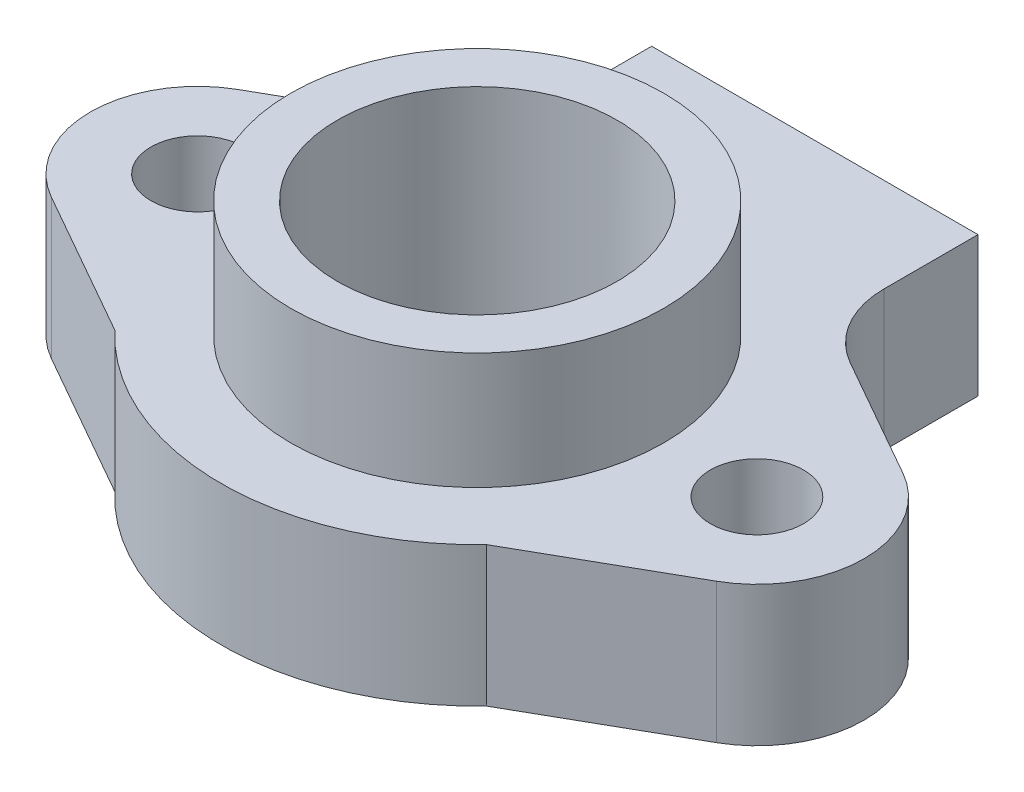
ISO-10303-21;
HEADER;
FILE_DESCRIPTION(('STEP AP214'),'2;1');
FILE_NAME('part.step','',(''),(''),'','','');
FILE_SCHEMA(('AUTOMOTIVE_DESIGN { 1 0 10303 214 1 1 1 1 }'));
ENDSEC;
DATA;
#1=APPLICATION_CONTEXT('core data for automotive mechanical design processes');
#2=APPLICATION_PROTOCOL_DEFINITION('international standard','automotive_design',2000,#1);
#3=PRODUCT_CONTEXT('',#1,'mechanical');
#4=PRODUCT('Part','Part','',(#3));
#5=PRODUCT_RELATED_PRODUCT_CATEGORY('part','',(#4));
#6=PRODUCT_DEFINITION_FORMATION('','',#4);
#7=PRODUCT_DEFINITION_CONTEXT('part definition',#1,'design');
#8=PRODUCT_DEFINITION('design','',#6,#7);
#9=PRODUCT_DEFINITION_SHAPE('','',#8);
#10=(LENGTH_UNIT() NAMED_UNIT(*) SI_UNIT(.MILLI.,.METRE.));
#11=(NAMED_UNIT(*) PLANE_ANGLE_UNIT() SI_UNIT($,.RADIAN.));
#12=(NAMED_UNIT(*) SI_UNIT($,.STERADIAN.) SOLID_ANGLE_UNIT());
#13=UNCERTAINTY_MEASURE_WITH_UNIT(LENGTH_MEASURE(1.E-05),#10,'distance_accuracy_value','');
#14=(GEOMETRIC_REPRESENTATION_CONTEXT(3) GLOBAL_UNCERTAINTY_ASSIGNED_CONTEXT((#13)) GLOBAL_UNIT_ASSIGNED_CONTEXT((#10,
#11,#12)) REPRESENTATION_CONTEXT('',''));
#15=CARTESIAN_POINT('',(0.,0.,0.));
#16=DIRECTION('',(0.,0.,1.));
#17=DIRECTION('',(1.,0.,0.));
#18=AXIS2_PLACEMENT_3D('',#15,#16,#17);
#19=CARTESIAN_POINT('',(0.,-5.,0.));
#20=DIRECTION('',(0.,1.,0.));
#21=DIRECTION('',(0.,0.,1.));
#22=AXIS2_PLACEMENT_3D('',#19,#20,#21);
#23=CYLINDRICAL_SURFACE('',#22,40.);
#24=CARTESIAN_POINT('',(0.,-5.,0.));
#25=DIRECTION('',(0.,1.,0.));
#26=DIRECTION('',(0.,0.,1.));
#27=AXIS2_PLACEMENT_3D('',#24,#25,#26);
#28=CIRCLE('',#27,40.);
#29=CARTESIAN_POINT('',(0.,-5.,40.));
#30=VERTEX_POINT('',#29);
#31=EDGE_CURVE('E289',#30,#30,#28,.T.);
#32=ORIENTED_EDGE('',*,*,#31,.T.);
#33=EDGE_LOOP('',(#32));
#34=FACE_BOUND('',#33,.T.);
#35=CARTESIAN_POINT('',(0.,0.,0.));
#36=DIRECTION('',(0.,1.,0.));
#37=DIRECTION('',(0.,0.,1.));
#38=AXIS2_PLACEMENT_3D('',#35,#36,#37);
#39=CIRCLE('',#38,40.);
#40=CARTESIAN_POINT('',(0.,0.,40.));
#41=VERTEX_POINT('',#40);
#42=EDGE_CURVE('E281',#41,#41,#39,.F.);
#43=ORIENTED_EDGE('',*,*,#42,.T.);
#44=EDGE_LOOP('',(#43));
#45=FACE_BOUND('',#44,.T.);
#46=ADVANCED_FACE('F35',(#34,#45),#23,.T.);
#47=CARTESIAN_POINT('',(0.,30.,0.));
#48=DIRECTION('',(0.,1.,0.));
#49=DIRECTION('',(0.,0.,1.));
#50=AXIS2_PLACEMENT_3D('',#47,#48,#49);
#51=CIRCLE('',#50,40.);
#52=CARTESIAN_POINT('',(0.,30.,40.));
#53=VERTEX_POINT('',#52);
#54=EDGE_CURVE('E285',#53,#53,#51,.F.);
#55=ORIENTED_EDGE('',*,*,#54,.F.);
#56=EDGE_LOOP('',(#55));
#57=FACE_BOUND('',#56,.T.);
#58=CARTESIAN_POINT('',(0.,55.,0.));
#59=DIRECTION('',(0.,1.,0.));
#60=DIRECTION('',(0.,0.,1.));
#61=AXIS2_PLACEMENT_3D('',#58,#59,#60);
#62=CIRCLE('',#61,40.);
#63=CARTESIAN_POINT('',(0.,55.,40.));
#64=VERTEX_POINT('',#63);
#65=EDGE_CURVE('E292',#64,#64,#62,.T.);
#66=ORIENTED_EDGE('',*,*,#65,.F.);
#67=EDGE_LOOP('',(#66));
#68=FACE_BOUND('',#67,.T.);
#69=ADVANCED_FACE('F370',(#57,#68),#23,.T.);
#70=CARTESIAN_POINT('',(0.,-5.,0.));
#71=DIRECTION('',(0.,1.,0.));
#72=DIRECTION('',(0.,0.,1.));
#73=AXIS2_PLACEMENT_3D('',#70,#71,#72);
#74=PLANE('',#73);
#75=CARTESIAN_POINT('',(0.,-5.,0.));
#76=DIRECTION('',(0.,1.,0.));
#77=DIRECTION('',(0.,0.,1.));
#78=AXIS2_PLACEMENT_3D('',#75,#76,#77);
#79=CIRCLE('',#78,30.);
#80=CARTESIAN_POINT('',(0.,-5.,30.));
#81=VERTEX_POINT('',#80);
#82=EDGE_CURVE('E295',#81,#81,#79,.T.);
#83=ORIENTED_EDGE('',*,*,#82,.T.);
#84=EDGE_LOOP('',(#83));
#85=FACE_BOUND('',#84,.T.);
#86=ORIENTED_EDGE('',*,*,#31,.F.);
#87=EDGE_LOOP('',(#86));
#88=FACE_BOUND('',#87,.T.);
#89=ADVANCED_FACE('F376',(#85,#88),#74,.F.);
#90=CARTESIAN_POINT('',(0.,-5.,0.));
#91=DIRECTION('',(0.,1.,0.));
#92=DIRECTION('',(0.,0.,1.));
#93=AXIS2_PLACEMENT_3D('',#90,#91,#92);
#94=CYLINDRICAL_SURFACE('',#93,30.);
#95=CARTESIAN_POINT('',(-4.5,15.,-29.6605798999278));
#96=CARTESIAN_POINT('',(-4.4999896232169,15.2512367078926,-29.6605840995083));
#97=CARTESIAN_POINT('',(-4.47888889164196,15.5026192523197,-29.6638065495494));
#98=CARTESIAN_POINT('',(-4.39506589969729,15.9983559447118,-29.6763394413827));
#99=CARTESIAN_POINT('',(-4.33230304207742,16.2427029944524,-29.6856558212155));
#100=CARTESIAN_POINT('',(-4.16707578294728,16.7171212663187,-29.7092981703132));
#101=CARTESIAN_POINT('',(-4.06464185044318,16.9472032876206,-29.7236202941407));
#102=CARTESIAN_POINT('',(-3.82305189263246,17.3868810923221,-29.7556558231997));
#103=CARTESIAN_POINT('',(-3.68390092289581,17.5964796906445,-29.7733687614577));
#104=CARTESIAN_POINT('',(-3.37163707255709,17.9909514502614,-29.8103486774939));
#105=CARTESIAN_POINT('',(-3.19828816754469,18.1756368402198,-29.8296258737559));
#106=CARTESIAN_POINT('',(-2.82305881633303,18.5134124569669,-29.8674710450573));
#107=CARTESIAN_POINT('',(-2.62117680235956,18.6665009465011,-29.8860389810546));
#108=CARTESIAN_POINT('',(-2.19340907415826,18.937429895074,-29.9204804228494));
#109=CARTESIAN_POINT('',(-1.9674126820973,19.0550974509673,-29.9363405530681));
#110=CARTESIAN_POINT('',(-1.49858655032092,19.2507347964245,-29.9634662023911));
#111=CARTESIAN_POINT('',(-1.25575770081203,19.3287066835287,-29.9747319642581));
#112=CARTESIAN_POINT('',(-0.76209336927171,19.4421701655925,-29.9913274439337));
#113=CARTESIAN_POINT('',(-0.5113316531696,19.4779761791615,-29.9967010766204));
#114=CARTESIAN_POINT('',(-0.00730561205843701,19.5070678044747,-30.0010573430875));
#115=CARTESIAN_POINT('',(0.245958573047238,19.5003557799591,-30.0000403321482));
#116=CARTESIAN_POINT('',(0.745655154601558,19.4448499867127,-29.9917649898239));
#117=CARTESIAN_POINT('',(0.992126074200022,19.3963944846255,-29.9845568295744));
#118=CARTESIAN_POINT('',(1.47339848742941,19.2593081810323,-29.9647650068355));
#119=CARTESIAN_POINT('',(1.70819968054044,19.1706763454957,-29.9521812059922));
#120=CARTESIAN_POINT('',(2.16049134231095,18.9554070092487,-29.9229658161962));
#121=CARTESIAN_POINT('',(2.37791301697079,18.8286271046738,-29.9063191054691));
#122=CARTESIAN_POINT('',(2.78852372145053,18.54076441899,-29.8708331473626));
#123=CARTESIAN_POINT('',(2.9817111548152,18.3796793798794,-29.8519937556955));
#124=CARTESIAN_POINT('',(3.34036344816793,18.0258946535202,-29.8140047457788));
#125=CARTESIAN_POINT('',(3.5055369885284,17.8328996340897,-29.7948538986977));
#126=CARTESIAN_POINT('',(3.80119798016438,17.4217767686288,-29.7585811336057));
#127=CARTESIAN_POINT('',(3.93168521783996,17.2036487678402,-29.7414592280895));
#128=CARTESIAN_POINT('',(4.15430893603814,16.7481481111781,-29.7111832586057));
#129=CARTESIAN_POINT('',(4.24641546810244,16.5107605990128,-29.6980322953587));
#130=CARTESIAN_POINT('',(4.38937008626637,16.0236442345578,-29.6772420869718));
#131=CARTESIAN_POINT('',(4.44022108011977,15.7739162533597,-29.669602453389));
#132=CARTESIAN_POINT('',(4.49882160259966,15.2717997312675,-29.6607735418508));
#133=CARTESIAN_POINT('',(4.50698409795156,15.0194604353954,-29.6595224640772));
#134=CARTESIAN_POINT('',(4.48107171059457,14.517017415548,-29.6634482381146));
#135=CARTESIAN_POINT('',(4.44699813846906,14.2669136224477,-29.6686248904733));
#136=CARTESIAN_POINT('',(4.33793108858298,13.7773205461031,-29.6847660738436));
#137=CARTESIAN_POINT('',(4.26314335583462,13.5377843851752,-29.6957014944857));
#138=CARTESIAN_POINT('',(4.07498495841259,13.0746477238542,-29.722104054773));
#139=CARTESIAN_POINT('',(3.96161238829166,12.8510480111154,-29.7375714182153));
#140=CARTESIAN_POINT('',(3.6985103398597,12.4242802189949,-29.7714406706119));
#141=CARTESIAN_POINT('',(3.54851353685298,12.2212786581606,-29.7898637783996));
#142=CARTESIAN_POINT('',(3.21679250511604,11.8431814203786,-29.8275047830006));
#143=CARTESIAN_POINT('',(3.03506648234038,11.6680873224565,-29.8467227247088));
#144=CARTESIAN_POINT('',(2.64322685888455,11.3492921800992,-29.8839811565216));
#145=CARTESIAN_POINT('',(2.43288938031587,11.2058648152726,-29.9020105038127));
#146=CARTESIAN_POINT('',(1.99086624079104,10.9563812842121,-29.9346871509605));
#147=CARTESIAN_POINT('',(1.75918116408131,10.8503240956049,-29.9493345433369));
#148=CARTESIAN_POINT('',(1.28189398758344,10.6790287725359,-29.9735480898238));
#149=CARTESIAN_POINT('',(1.03634657626291,10.6136409987649,-29.9831328515369));
#150=CARTESIAN_POINT('',(0.537602446503576,10.5250563613876,-29.9962192997069));
#151=CARTESIAN_POINT('',(0.284406234391735,10.5018567112526,-29.9997213879243));
#152=CARTESIAN_POINT('',(-0.219793772582452,10.4983748863518,-30.000243871774));
#153=CARTESIAN_POINT('',(-0.470794710636137,10.517673957369,-29.9973275107131));
#154=CARTESIAN_POINT('',(-0.965939385969342,10.5977441652623,-29.9854683155751));
#155=CARTESIAN_POINT('',(-1.21008314518962,10.6585151694258,-29.976525500783));
#156=CARTESIAN_POINT('',(-1.68446812313891,10.8196556267106,-29.9536136022709));
#157=CARTESIAN_POINT('',(-1.91471937944606,10.9199960854162,-29.9396481994971));
#158=CARTESIAN_POINT('',(-2.3551833536901,11.15738246395,-29.9082250348763));
#159=CARTESIAN_POINT('',(-2.56539542076321,11.2944295754432,-29.8907671596523));
#160=CARTESIAN_POINT('',(-2.96193775557478,11.6028530964853,-29.8540953190428));
#161=CARTESIAN_POINT('',(-3.14802619933503,11.7745386774407,-29.8348664526187));
#162=CARTESIAN_POINT('',(-3.48890425171214,12.1467152192498,-29.7969300508296));
#163=CARTESIAN_POINT('',(-3.64368650398486,12.3472129315043,-29.7782226388846));
#164=CARTESIAN_POINT('',(-3.91833932467686,12.772646949671,-29.7433345202739));
#165=CARTESIAN_POINT('',(-4.03800882868385,12.997714250958,-29.7271686024667));
#166=CARTESIAN_POINT('',(-4.23766841610925,13.4648903301814,-29.6993672711643));
#167=CARTESIAN_POINT('',(-4.3176996772349,13.7069811235448,-29.6877271588058));
#168=CARTESIAN_POINT('',(-4.41764855670801,14.1251323087847,-29.6729845660442));
#169=CARTESIAN_POINT('',(-4.44848309341412,14.2986101907787,-29.66835748145));
#170=CARTESIAN_POINT('',(-4.4896623172957,14.6480348751971,-29.6621536970317));
#171=CARTESIAN_POINT('',(-4.5000072700534,14.8239816455905,-29.6605769576696));
#172=CARTESIAN_POINT('',(-4.5,15.,-29.6605798999278));
#173=B_SPLINE_CURVE_WITH_KNOTS('',3,(#95,#96,#97,#98,#99,#100,#101,#102,#103,#104,#105,#106,
#107,#108,#109,#110,#111,#112,#113,#114,#115,#116,#117,#118,#119,#120,#121,#122,#123,#124,#125,
#126,#127,#128,#129,#130,#131,#132,#133,#134,#135,#136,#137,#138,#139,#140,#141,#142,#143,#144,
#145,#146,#147,#148,#149,#150,#151,#152,#153,#154,#155,#156,#157,#158,#159,#160,#161,#162,#163,
#164,#165,#166,#167,#168,#169,#170,#171,#172),.UNSPECIFIED.,.T.,.F.,(4,2,2,2,2,2,2,2,2,2,2,2,2,
2,2,2,2,2,2,2,2,2,2,2,2,2,2,2,2,2,2,2,2,2,2,2,2,2,4),(0.,0.753066755447145,1.50686840874858,
2.26009225607019,3.01321244604715,3.77172475953639,4.53027876629768,5.29247766323663,
6.05463628099818,6.81107497609507,7.56747161824438,8.317795875535,9.0681394452452,
9.82131949165677,10.5745491285413,11.3351863400512,12.0958282354937,12.8570625532573,
13.6182432133934,14.3720464381755,15.1258262730607,15.8758318442844,16.6258744586467,
17.3815645801022,18.1372974439172,18.8993261326686,19.6613339722188,20.4205212267958,
21.1796583351773,21.9313489087329,22.6830370768478,23.4341754677981,24.1853382470763,
24.9435285003922,25.701896707169,26.4645263648281,27.2263621034676,27.753973256849,
28.2815775713864),.UNSPECIFIED.);
#174=CARTESIAN_POINT('',(-4.5,15.,-29.6605798999278));
#175=VERTEX_POINT('',#174);
#176=EDGE_CURVE('E39',#175,#175,#173,.T.);
#177=ORIENTED_EDGE('',*,*,#176,.T.);
#178=EDGE_LOOP('',(#177));
#179=FACE_BOUND('',#178,.T.);
#180=CARTESIAN_POINT('',(0.,55.,0.));
#181=DIRECTION('',(0.,1.,0.));
#182=DIRECTION('',(0.,0.,1.));
#183=AXIS2_PLACEMENT_3D('',#180,#181,#182);
#184=CIRCLE('',#183,30.);
#185=CARTESIAN_POINT('',(0.,55.,30.));
#186=VERTEX_POINT('',#185);
#187=EDGE_CURVE('E284',#186,#186,#184,.T.);
#188=ORIENTED_EDGE('',*,*,#187,.T.);
#189=EDGE_LOOP('',(#188));
#190=FACE_BOUND('',#189,.T.);
#191=ORIENTED_EDGE('',*,*,#82,.F.);
#192=EDGE_LOOP('',(#191));
#193=FACE_BOUND('',#192,.T.);
#194=ADVANCED_FACE('F532',(#179,#190,#193),#94,.F.);
#195=CARTESIAN_POINT('',(0.,55.,0.));
#196=DIRECTION('',(0.,1.,0.));
#197=DIRECTION('',(0.,0.,1.));
#198=AXIS2_PLACEMENT_3D('',#195,#196,#197);
#199=PLANE('',#198);
#200=ORIENTED_EDGE('',*,*,#65,.T.);
#201=EDGE_LOOP('',(#200));
#202=FACE_BOUND('',#201,.T.);
#203=ORIENTED_EDGE('',*,*,#187,.F.);
#204=EDGE_LOOP('',(#203));
#205=FACE_BOUND('',#204,.T.);
#206=ADVANCED_FACE('F535',(#202,#205),#199,.T.);
#207=CARTESIAN_POINT('',(0.,30.,0.));
#208=DIRECTION('',(0.,-1.,0.));
#209=DIRECTION('',(0.,0.,-1.));
#210=AXIS2_PLACEMENT_3D('',#207,#208,#209);
#211=CYLINDRICAL_SURFACE('',#210,55.);
#212=CARTESIAN_POINT('',(0.,0.,0.));
#213=DIRECTION('',(0.,1.,0.));
#214=DIRECTION('',(0.,0.,1.));
#215=AXIS2_PLACEMENT_3D('',#212,#213,#214);
#216=CIRCLE('',#215,55.);
#217=CARTESIAN_POINT('',(39.875,0.,37.8811876133788));
#218=VERTEX_POINT('',#217);
#219=CARTESIAN_POINT('',(-39.875,0.,37.8811876133787));
#220=VERTEX_POINT('',#219);
#221=EDGE_CURVE('E236',#218,#220,#216,.F.);
#222=ORIENTED_EDGE('',*,*,#221,.F.);
#223=DIRECTION('',(0.,-1.,0.));
#224=VECTOR('',#223,1.);
#225=CARTESIAN_POINT('',(39.875,30.,37.8811876133788));
#226=LINE('',#225,#224);
#227=CARTESIAN_POINT('',(39.875,30.,37.8811876133788));
#228=VERTEX_POINT('',#227);
#229=EDGE_CURVE('E279',#228,#218,#226,.T.);
#230=ORIENTED_EDGE('',*,*,#229,.F.);
#231=CARTESIAN_POINT('',(0.,30.,0.));
#232=DIRECTION('',(0.,1.,0.));
#233=DIRECTION('',(0.,0.,1.));
#234=AXIS2_PLACEMENT_3D('',#231,#232,#233);
#235=CIRCLE('',#234,55.);
#236=CARTESIAN_POINT('',(-39.875,30.,37.8811876133787));
#237=VERTEX_POINT('',#236);
#238=EDGE_CURVE('E202',#228,#237,#235,.F.);
#239=ORIENTED_EDGE('',*,*,#238,.T.);
#240=DIRECTION('',(0.,-1.,0.));
#241=VECTOR('',#240,1.);
#242=CARTESIAN_POINT('',(-39.875,30.,37.8811876133787));
#243=LINE('',#242,#241);
#244=EDGE_CURVE('E230',#237,#220,#243,.T.);
#245=ORIENTED_EDGE('',*,*,#244,.T.);
#246=EDGE_LOOP('',(#222,#230,#239,#245));
#247=FACE_BOUND('',#246,.T.);
#248=ADVANCED_FACE('F354',(#247),#211,.T.);
#249=CARTESIAN_POINT('',(25.9932931094952,30.,45.7655331321565));
#250=DIRECTION('',(0.493867915200675,0.,0.869536935578552));
#251=DIRECTION('',(0.869536935578552,0.,-0.493867915200675));
#252=AXIS2_PLACEMENT_3D('',#249,#250,#251);
#253=PLANE('',#252);
#254=DIRECTION('',(-0.869536935578552,0.,0.493867915200675));
#255=VECTOR('',#254,1.);
#256=CARTESIAN_POINT('',(25.9932931094952,0.,45.7655331321565));
#257=LINE('',#256,#255);
#258=CARTESIAN_POINT('',(71.3589620496155,0.,19.9993495183067));
#259=VERTEX_POINT('',#258);
#260=EDGE_CURVE('E239',#259,#218,#257,.T.);
#261=ORIENTED_EDGE('',*,*,#260,.F.);
#262=DIRECTION('',(0.,-1.,0.));
#263=VECTOR('',#262,1.);
#264=CARTESIAN_POINT('',(71.3589620496155,30.,19.9993495183067));
#265=LINE('',#264,#263);
#266=CARTESIAN_POINT('',(71.3589620496155,30.,19.9993495183067));
#267=VERTEX_POINT('',#266);
#268=EDGE_CURVE('E277',#267,#259,#265,.T.);
#269=ORIENTED_EDGE('',*,*,#268,.F.);
#270=DIRECTION('',(-0.869536935578552,0.,0.493867915200675));
#271=VECTOR('',#270,1.);
#272=CARTESIAN_POINT('',(25.9932931094952,30.,45.7655331321565));
#273=LINE('',#272,#271);
#274=EDGE_CURVE('E205',#267,#228,#273,.T.);
#275=ORIENTED_EDGE('',*,*,#274,.T.);
#276=ORIENTED_EDGE('',*,*,#229,.T.);
#277=EDGE_LOOP('',(#261,#269,#275,#276));
#278=FACE_BOUND('',#277,.T.);
#279=ADVANCED_FACE('F357',(#278),#253,.T.);
#280=CARTESIAN_POINT('',(60.,30.,0.));
#281=DIRECTION('',(0.,-1.,0.));
#282=DIRECTION('',(0.,0.,-1.));
#283=AXIS2_PLACEMENT_3D('',#280,#281,#282);
#284=CYLINDRICAL_SURFACE('',#283,23.);
#285=CARTESIAN_POINT('',(60.,0.,0.));
#286=DIRECTION('',(0.,1.,0.));
#287=DIRECTION('',(0.,0.,1.));
#288=AXIS2_PLACEMENT_3D('',#285,#286,#287);
#289=CIRCLE('',#288,23.);
#290=CARTESIAN_POINT('',(71.3589620496155,0.,-19.9993495183067));
#291=VERTEX_POINT('',#290);
#292=EDGE_CURVE('E242',#259,#291,#289,.T.);
#293=ORIENTED_EDGE('',*,*,#292,.T.);
#294=DIRECTION('',(0.,-1.,0.));
#295=VECTOR('',#294,1.);
#296=CARTESIAN_POINT('',(71.3589620496155,30.,-19.9993495183067));
#297=LINE('',#296,#295);
#298=CARTESIAN_POINT('',(71.3589620496155,30.,-19.9993495183067));
#299=VERTEX_POINT('',#298);
#300=EDGE_CURVE('E274',#299,#291,#297,.T.);
#301=ORIENTED_EDGE('',*,*,#300,.F.);
#302=CARTESIAN_POINT('',(60.,30.,0.));
#303=DIRECTION('',(0.,1.,0.));
#304=DIRECTION('',(0.,0.,1.));
#305=AXIS2_PLACEMENT_3D('',#302,#303,#304);
#306=CIRCLE('',#305,23.);
#307=EDGE_CURVE('E208',#267,#299,#306,.T.);
#308=ORIENTED_EDGE('',*,*,#307,.F.);
#309=ORIENTED_EDGE('',*,*,#268,.T.);
#310=EDGE_LOOP('',(#293,#301,#308,#309));
#311=FACE_BOUND('',#310,.T.);
#312=ADVANCED_FACE('F360',(#311),#284,.T.);
#313=CARTESIAN_POINT('',(25.9932931094952,30.,-45.7655331321565));
#314=DIRECTION('',(-0.493867915200675,0.,0.869536935578552));
#315=DIRECTION('',(0.869536935578552,0.,0.493867915200675));
#316=AXIS2_PLACEMENT_3D('',#313,#314,#315);
#317=PLANE('',#316);
#318=DIRECTION('',(-0.869536935578552,0.,-0.493867915200675));
#319=VECTOR('',#318,1.);
#320=CARTESIAN_POINT('',(25.9932931094952,0.,-45.7655331321565));
#321=LINE('',#320,#319);
#322=CARTESIAN_POINT('',(45.1226416959865,0.,-34.9007025320951));
#323=VERTEX_POINT('',#322);
#324=EDGE_CURVE('E245',#291,#323,#321,.T.);
#325=ORIENTED_EDGE('',*,*,#324,.T.);
#326=DIRECTION('',(0.,-1.,0.));
#327=VECTOR('',#326,1.);
#328=CARTESIAN_POINT('',(45.1226416959865,30.,-34.9007025320951));
#329=LINE('',#328,#327);
#330=CARTESIAN_POINT('',(45.1226416959865,30.,-34.9007025320951));
#331=VERTEX_POINT('',#330);
#332=EDGE_CURVE('E64',#323,#331,#329,.F.);
#333=ORIENTED_EDGE('',*,*,#332,.T.);
#334=DIRECTION('',(-0.869536935578552,0.,-0.493867915200675));
#335=VECTOR('',#334,1.);
#336=CARTESIAN_POINT('',(25.9932931094952,30.,-45.7655331321565));
#337=LINE('',#336,#335);
#338=EDGE_CURVE('E211',#299,#331,#337,.T.);
#339=ORIENTED_EDGE('',*,*,#338,.F.);
#340=ORIENTED_EDGE('',*,*,#300,.T.);
#341=EDGE_LOOP('',(#325,#333,#339,#340));
#342=FACE_BOUND('',#341,.T.);
#343=ADVANCED_FACE('F318',(#342),#317,.F.);
#344=CARTESIAN_POINT('',(35.,30.,0.));
#345=DIRECTION('',(1.,0.,0.));
#346=DIRECTION('',(0.,0.,-1.));
#347=AXIS2_PLACEMENT_3D('',#344,#345,#346);
#348=PLANE('',#347);
#349=DIRECTION('',(0.,0.,1.));
#350=VECTOR('',#349,1.);
#351=CARTESIAN_POINT('',(35.,30.,0.));
#352=LINE('',#351,#350);
#353=CARTESIAN_POINT('',(35.,30.,-72.4264068711928));
#354=VERTEX_POINT('',#353);
#355=CARTESIAN_POINT('',(35.,30.,-52.2914412436661));
#356=VERTEX_POINT('',#355);
#357=EDGE_CURVE('E213',#354,#356,#352,.T.);
#358=ORIENTED_EDGE('',*,*,#357,.T.);
#359=DIRECTION('',(0.,-1.,0.));
#360=VECTOR('',#359,1.);
#361=CARTESIAN_POINT('',(35.,30.,-52.2914412436661));
#362=LINE('',#361,#360);
#363=CARTESIAN_POINT('',(35.,0.,-52.2914412436661));
#364=VERTEX_POINT('',#363);
#365=EDGE_CURVE('E304',#356,#364,#362,.T.);
#366=ORIENTED_EDGE('',*,*,#365,.T.);
#367=DIRECTION('',(0.,0.,1.));
#368=VECTOR('',#367,1.);
#369=CARTESIAN_POINT('',(35.,0.,0.));
#370=LINE('',#369,#368);
#371=CARTESIAN_POINT('',(35.,0.,-72.4264068711928));
#372=VERTEX_POINT('',#371);
#373=EDGE_CURVE('E247',#372,#364,#370,.T.);
#374=ORIENTED_EDGE('',*,*,#373,.F.);
#375=DIRECTION('',(0.,-1.,0.));
#376=VECTOR('',#375,1.);
#377=CARTESIAN_POINT('',(35.,30.,-72.4264068711928));
#378=LINE('',#377,#376);
#379=EDGE_CURVE('E272',#354,#372,#378,.T.);
#380=ORIENTED_EDGE('',*,*,#379,.F.);
#381=EDGE_LOOP('',(#358,#366,#374,#380));
#382=FACE_BOUND('',#381,.T.);
#383=ADVANCED_FACE('F327',(#382),#348,.T.);
#384=CARTESIAN_POINT('',(0.,30.,-72.4264068711928));
#385=DIRECTION('',(0.,0.,-1.));
#386=DIRECTION('',(-1.,0.,0.));
#387=AXIS2_PLACEMENT_3D('',#384,#385,#386);
#388=PLANE('',#387);
#389=DIRECTION('',(0.,-1.,0.));
#390=VECTOR('',#389,1.);
#391=CARTESIAN_POINT('',(30.,25.,-72.4264068711928));
#392=LINE('',#391,#390);
#393=CARTESIAN_POINT('',(30.,25.,-72.4264068711928));
#394=VERTEX_POINT('',#393);
#395=CARTESIAN_POINT('',(30.,5.,-72.4264068711928));
#396=VERTEX_POINT('',#395);
#397=EDGE_CURVE('E56',#394,#396,#392,.T.);
#398=ORIENTED_EDGE('',*,*,#397,.F.);
#399=DIRECTION('',(1.,0.,0.));
#400=VECTOR('',#399,1.);
#401=CARTESIAN_POINT('',(-30.,25.,-72.4264068711928));
#402=LINE('',#401,#400);
#403=CARTESIAN_POINT('',(-30.,25.,-72.4264068711928));
#404=VERTEX_POINT('',#403);
#405=EDGE_CURVE('E174',#404,#394,#402,.T.);
#406=ORIENTED_EDGE('',*,*,#405,.F.);
#407=DIRECTION('',(0.,1.,0.));
#408=VECTOR('',#407,1.);
#409=CARTESIAN_POINT('',(-30.,25.,-72.4264068711928));
#410=LINE('',#409,#408);
#411=CARTESIAN_POINT('',(-30.,5.,-72.4264068711928));
#412=VERTEX_POINT('',#411);
#413=EDGE_CURVE('E177',#412,#404,#410,.T.);
#414=ORIENTED_EDGE('',*,*,#413,.F.);
#415=DIRECTION('',(-1.,0.,0.));
#416=VECTOR('',#415,1.);
#417=CARTESIAN_POINT('',(-30.,5.,-72.4264068711928));
#418=LINE('',#417,#416);
#419=EDGE_CURVE('E185',#396,#412,#418,.T.);
#420=ORIENTED_EDGE('',*,*,#419,.F.);
#421=EDGE_LOOP('',(#398,#406,#414,#420));
#422=FACE_BOUND('',#421,.T.);
#423=DIRECTION('',(1.,0.,0.));
#424=VECTOR('',#423,1.);
#425=CARTESIAN_POINT('',(0.,0.,-72.4264068711928));
#426=LINE('',#425,#424);
#427=CARTESIAN_POINT('',(-35.,0.,-72.4264068711928));
#428=VERTEX_POINT('',#427);
#429=EDGE_CURVE('E250',#428,#372,#426,.T.);
#430=ORIENTED_EDGE('',*,*,#429,.F.);
#431=DIRECTION('',(0.,-1.,0.));
#432=VECTOR('',#431,1.);
#433=CARTESIAN_POINT('',(-35.,30.,-72.4264068711928));
#434=LINE('',#433,#432);
#435=CARTESIAN_POINT('',(-35.,30.,-72.4264068711928));
#436=VERTEX_POINT('',#435);
#437=EDGE_CURVE('E270',#436,#428,#434,.T.);
#438=ORIENTED_EDGE('',*,*,#437,.F.);
#439=DIRECTION('',(1.,0.,0.));
#440=VECTOR('',#439,1.);
#441=CARTESIAN_POINT('',(0.,30.,-72.4264068711928));
#442=LINE('',#441,#440);
#443=EDGE_CURVE('E216',#436,#354,#442,.T.);
#444=ORIENTED_EDGE('',*,*,#443,.T.);
#445=ORIENTED_EDGE('',*,*,#379,.T.);
#446=EDGE_LOOP('',(#430,#438,#444,#445));
#447=FACE_BOUND('',#446,.T.);
#448=ADVANCED_FACE('F330',(#422,#447),#388,.T.);
#449=CARTESIAN_POINT('',(-35.,30.,0.));
#450=DIRECTION('',(1.,0.,0.));
#451=DIRECTION('',(0.,0.,-1.));
#452=AXIS2_PLACEMENT_3D('',#449,#450,#451);
#453=PLANE('',#452);
#454=DIRECTION('',(0.,0.,1.));
#455=VECTOR('',#454,1.);
#456=CARTESIAN_POINT('',(-35.,0.,0.));
#457=LINE('',#456,#455);
#458=CARTESIAN_POINT('',(-35.,0.,-52.2914412436661));
#459=VERTEX_POINT('',#458);
#460=EDGE_CURVE('E253',#428,#459,#457,.T.);
#461=ORIENTED_EDGE('',*,*,#460,.T.);
#462=DIRECTION('',(0.,-1.,0.));
#463=VECTOR('',#462,1.);
#464=CARTESIAN_POINT('',(-35.,30.,-52.2914412436661));
#465=LINE('',#464,#463);
#466=CARTESIAN_POINT('',(-35.,30.,-52.2914412436661));
#467=VERTEX_POINT('',#466);
#468=EDGE_CURVE('E302',#459,#467,#465,.F.);
#469=ORIENTED_EDGE('',*,*,#468,.T.);
#470=DIRECTION('',(0.,0.,1.));
#471=VECTOR('',#470,1.);
#472=CARTESIAN_POINT('',(-35.,30.,0.));
#473=LINE('',#472,#471);
#474=EDGE_CURVE('E219',#436,#467,#473,.T.);
#475=ORIENTED_EDGE('',*,*,#474,.F.);
#476=ORIENTED_EDGE('',*,*,#437,.T.);
#477=EDGE_LOOP('',(#461,#469,#475,#476));
#478=FACE_BOUND('',#477,.T.);
#479=ADVANCED_FACE('F404',(#478),#453,.F.);
#480=CARTESIAN_POINT('',(-25.9932931094951,30.,-45.7655331321565));
#481=DIRECTION('',(-0.493867915200674,0.,-0.869536935578552));
#482=DIRECTION('',(-0.869536935578553,0.,0.493867915200674));
#483=AXIS2_PLACEMENT_3D('',#480,#481,#482);
#484=PLANE('',#483);
#485=DIRECTION('',(0.869536935578553,0.,-0.493867915200674));
#486=VECTOR('',#485,1.);
#487=CARTESIAN_POINT('',(-25.9932931094951,30.,-45.7655331321565));
#488=LINE('',#487,#486);
#489=CARTESIAN_POINT('',(-71.3589620496155,30.,-19.9993495183067));
#490=VERTEX_POINT('',#489);
#491=CARTESIAN_POINT('',(-45.1226416959865,30.,-34.9007025320951));
#492=VERTEX_POINT('',#491);
#493=EDGE_CURVE('E222',#490,#492,#488,.T.);
#494=ORIENTED_EDGE('',*,*,#493,.T.);
#495=DIRECTION('',(0.,-1.,0.));
#496=VECTOR('',#495,1.);
#497=CARTESIAN_POINT('',(-45.1226416959865,30.,-34.9007025320951));
#498=LINE('',#497,#496);
#499=CARTESIAN_POINT('',(-45.1226416959865,0.,-34.9007025320951));
#500=VERTEX_POINT('',#499);
#501=EDGE_CURVE('E288',#492,#500,#498,.T.);
#502=ORIENTED_EDGE('',*,*,#501,.T.);
#503=DIRECTION('',(0.869536935578553,0.,-0.493867915200674));
#504=VECTOR('',#503,1.);
#505=CARTESIAN_POINT('',(-25.9932931094951,0.,-45.7655331321565));
#506=LINE('',#505,#504);
#507=CARTESIAN_POINT('',(-71.3589620496155,0.,-19.9993495183067));
#508=VERTEX_POINT('',#507);
#509=EDGE_CURVE('E256',#508,#500,#506,.T.);
#510=ORIENTED_EDGE('',*,*,#509,.F.);
#511=DIRECTION('',(0.,-1.,0.));
#512=VECTOR('',#511,1.);
#513=CARTESIAN_POINT('',(-71.3589620496155,30.,-19.9993495183067));
#514=LINE('',#513,#512);
#515=EDGE_CURVE('E268',#490,#508,#514,.T.);
#516=ORIENTED_EDGE('',*,*,#515,.F.);
#517=EDGE_LOOP('',(#494,#502,#510,#516));
#518=FACE_BOUND('',#517,.T.);
#519=ADVANCED_FACE('F341',(#518),#484,.T.);
#520=CARTESIAN_POINT('',(-60.,30.,0.));
#521=DIRECTION('',(0.,-1.,0.));
#522=DIRECTION('',(0.,0.,-1.));
#523=AXIS2_PLACEMENT_3D('',#520,#521,#522);
#524=CYLINDRICAL_SURFACE('',#523,23.);
#525=CARTESIAN_POINT('',(-60.,0.,0.));
#526=DIRECTION('',(0.,1.,0.));
#527=DIRECTION('',(0.,0.,1.));
#528=AXIS2_PLACEMENT_3D('',#525,#526,#527);
#529=CIRCLE('',#528,23.);
#530=CARTESIAN_POINT('',(-71.3589620496155,0.,19.9993495183067));
#531=VERTEX_POINT('',#530);
#532=EDGE_CURVE('E259',#508,#531,#529,.T.);
#533=ORIENTED_EDGE('',*,*,#532,.T.);
#534=DIRECTION('',(0.,-1.,0.));
#535=VECTOR('',#534,1.);
#536=CARTESIAN_POINT('',(-71.3589620496155,30.,19.9993495183067));
#537=LINE('',#536,#535);
#538=CARTESIAN_POINT('',(-71.3589620496155,30.,19.9993495183067));
#539=VERTEX_POINT('',#538);
#540=EDGE_CURVE('E265',#539,#531,#537,.T.);
#541=ORIENTED_EDGE('',*,*,#540,.F.);
#542=CARTESIAN_POINT('',(-60.,30.,0.));
#543=DIRECTION('',(0.,1.,0.));
#544=DIRECTION('',(0.,0.,1.));
#545=AXIS2_PLACEMENT_3D('',#542,#543,#544);
#546=CIRCLE('',#545,23.);
#547=EDGE_CURVE('E225',#490,#539,#546,.T.);
#548=ORIENTED_EDGE('',*,*,#547,.F.);
#549=ORIENTED_EDGE('',*,*,#515,.T.);
#550=EDGE_LOOP('',(#533,#541,#548,#549));
#551=FACE_BOUND('',#550,.T.);
#552=ADVANCED_FACE('F346',(#551),#524,.T.);
#553=CARTESIAN_POINT('',(-60.,30.,0.));
#554=DIRECTION('',(0.,-1.,0.));
#555=DIRECTION('',(0.,0.,-1.));
#556=AXIS2_PLACEMENT_3D('',#553,#554,#555);
#557=CYLINDRICAL_SURFACE('',#556,10.);
#558=CARTESIAN_POINT('',(-60.,30.,0.));
#559=DIRECTION('',(0.,1.,0.));
#560=DIRECTION('',(0.,0.,1.));
#561=AXIS2_PLACEMENT_3D('',#558,#559,#560);
#562=CIRCLE('',#561,10.);
#563=CARTESIAN_POINT('',(-60.,30.,10.));
#564=VERTEX_POINT('',#563);
#565=EDGE_CURVE('E198',#564,#564,#562,.T.);
#566=ORIENTED_EDGE('',*,*,#565,.T.);
#567=EDGE_LOOP('',(#566));
#568=FACE_BOUND('',#567,.T.);
#569=CARTESIAN_POINT('',(-60.,0.,0.));
#570=DIRECTION('',(0.,1.,0.));
#571=DIRECTION('',(0.,0.,1.));
#572=AXIS2_PLACEMENT_3D('',#569,#570,#571);
#573=CIRCLE('',#572,10.);
#574=CARTESIAN_POINT('',(-60.,0.,10.));
#575=VERTEX_POINT('',#574);
#576=EDGE_CURVE('E233',#575,#575,#573,.T.);
#577=ORIENTED_EDGE('',*,*,#576,.F.);
#578=EDGE_LOOP('',(#577));
#579=FACE_BOUND('',#578,.T.);
#580=ADVANCED_FACE('F401',(#568,#579),#557,.F.);
#581=CARTESIAN_POINT('',(60.,30.,0.));
#582=DIRECTION('',(0.,-1.,0.));
#583=DIRECTION('',(0.,0.,-1.));
#584=AXIS2_PLACEMENT_3D('',#581,#582,#583);
#585=CYLINDRICAL_SURFACE('',#584,9.99999999999999);
#586=CARTESIAN_POINT('',(60.,30.,0.));
#587=DIRECTION('',(0.,1.,0.));
#588=DIRECTION('',(0.,0.,1.));
#589=AXIS2_PLACEMENT_3D('',#586,#587,#588);
#590=CIRCLE('',#589,9.99999999999999);
#591=CARTESIAN_POINT('',(60.,30.,9.99999999999999));
#592=VERTEX_POINT('',#591);
#593=EDGE_CURVE('E195',#592,#592,#590,.T.);
#594=ORIENTED_EDGE('',*,*,#593,.T.);
#595=EDGE_LOOP('',(#594));
#596=FACE_BOUND('',#595,.T.);
#597=CARTESIAN_POINT('',(60.,0.,0.));
#598=DIRECTION('',(0.,1.,0.));
#599=DIRECTION('',(0.,0.,1.));
#600=AXIS2_PLACEMENT_3D('',#597,#598,#599);
#601=CIRCLE('',#600,9.99999999999999);
#602=CARTESIAN_POINT('',(60.,0.,9.99999999999999));
#603=VERTEX_POINT('',#602);
#604=EDGE_CURVE('E191',#603,#603,#601,.T.);
#605=ORIENTED_EDGE('',*,*,#604,.F.);
#606=EDGE_LOOP('',(#605));
#607=FACE_BOUND('',#606,.T.);
#608=ADVANCED_FACE('F398',(#596,#607),#585,.F.);
#609=CARTESIAN_POINT('',(-25.9932931094951,30.,45.7655331321565));
#610=DIRECTION('',(0.493867915200674,0.,-0.869536935578552));
#611=DIRECTION('',(-0.869536935578552,0.,-0.493867915200674));
#612=AXIS2_PLACEMENT_3D('',#609,#610,#611);
#613=PLANE('',#612);
#614=DIRECTION('',(0.869536935578552,0.,0.493867915200674));
#615=VECTOR('',#614,1.);
#616=CARTESIAN_POINT('',(-25.9932931094951,0.,45.7655331321565));
#617=LINE('',#616,#615);
#618=EDGE_CURVE('E199',#531,#220,#617,.T.);
#619=ORIENTED_EDGE('',*,*,#618,.T.);
#620=ORIENTED_EDGE('',*,*,#244,.F.);
#621=DIRECTION('',(0.869536935578552,0.,0.493867915200674));
#622=VECTOR('',#621,1.);
#623=CARTESIAN_POINT('',(-25.9932931094951,30.,45.7655331321565));
#624=LINE('',#623,#622);
#625=EDGE_CURVE('E228',#539,#237,#624,.T.);
#626=ORIENTED_EDGE('',*,*,#625,.F.);
#627=ORIENTED_EDGE('',*,*,#540,.T.);
#628=EDGE_LOOP('',(#619,#620,#626,#627));
#629=FACE_BOUND('',#628,.T.);
#630=ADVANCED_FACE('F351',(#629),#613,.F.);
#631=CARTESIAN_POINT('',(0.,30.,0.));
#632=DIRECTION('',(0.,1.,0.));
#633=DIRECTION('',(0.,0.,1.));
#634=AXIS2_PLACEMENT_3D('',#631,#632,#633);
#635=PLANE('',#634);
#636=ORIENTED_EDGE('',*,*,#54,.T.);
#637=EDGE_LOOP('',(#636));
#638=FACE_BOUND('',#637,.T.);
#639=ORIENTED_EDGE('',*,*,#593,.F.);
#640=EDGE_LOOP('',(#639));
#641=FACE_BOUND('',#640,.T.);
#642=ORIENTED_EDGE('',*,*,#565,.F.);
#643=EDGE_LOOP('',(#642));
#644=FACE_BOUND('',#643,.T.);
#645=ORIENTED_EDGE('',*,*,#238,.F.);
#646=ORIENTED_EDGE('',*,*,#274,.F.);
#647=ORIENTED_EDGE('',*,*,#307,.T.);
#648=ORIENTED_EDGE('',*,*,#338,.T.);
#649=CARTESIAN_POINT('',(55.,30.,-52.2914412436661));
#650=DIRECTION('',(0.,1.,0.));
#651=DIRECTION('',(0.,0.,1.));
#652=AXIS2_PLACEMENT_3D('',#649,#650,#651);
#653=CIRCLE('',#652,20.);
#654=EDGE_CURVE('E11',#331,#356,#653,.F.);
#655=ORIENTED_EDGE('',*,*,#654,.T.);
#656=ORIENTED_EDGE('',*,*,#357,.F.);
#657=ORIENTED_EDGE('',*,*,#443,.F.);
#658=ORIENTED_EDGE('',*,*,#474,.T.);
#659=CARTESIAN_POINT('',(-55.,30.,-52.2914412436661));
#660=DIRECTION('',(0.,1.,0.));
#661=DIRECTION('',(0.,0.,1.));
#662=AXIS2_PLACEMENT_3D('',#659,#660,#661);
#663=CIRCLE('',#662,20.);
#664=EDGE_CURVE('E310',#467,#492,#663,.F.);
#665=ORIENTED_EDGE('',*,*,#664,.T.);
#666=ORIENTED_EDGE('',*,*,#493,.F.);
#667=ORIENTED_EDGE('',*,*,#547,.T.);
#668=ORIENTED_EDGE('',*,*,#625,.T.);
#669=EDGE_LOOP('',(#645,#646,#647,#648,#655,#656,#657,#658,#665,#666,#667,#668));
#670=FACE_BOUND('',#669,.T.);
#671=ADVANCED_FACE('F324',(#638,#641,#644,#670),#635,.T.);
#672=CARTESIAN_POINT('',(0.,0.,0.));
#673=DIRECTION('',(0.,1.,0.));
#674=DIRECTION('',(0.,0.,1.));
#675=AXIS2_PLACEMENT_3D('',#672,#673,#674);
#676=PLANE('',#675);
#677=ORIENTED_EDGE('',*,*,#42,.F.);
#678=EDGE_LOOP('',(#677));
#679=FACE_BOUND('',#678,.T.);
#680=ORIENTED_EDGE('',*,*,#604,.T.);
#681=EDGE_LOOP('',(#680));
#682=FACE_BOUND('',#681,.T.);
#683=ORIENTED_EDGE('',*,*,#576,.T.);
#684=EDGE_LOOP('',(#683));
#685=FACE_BOUND('',#684,.T.);
#686=ORIENTED_EDGE('',*,*,#221,.T.);
#687=ORIENTED_EDGE('',*,*,#618,.F.);
#688=ORIENTED_EDGE('',*,*,#532,.F.);
#689=ORIENTED_EDGE('',*,*,#509,.T.);
#690=CARTESIAN_POINT('',(-55.,0.,-52.2914412436661));
#691=DIRECTION('',(0.,1.,0.));
#692=DIRECTION('',(0.,0.,1.));
#693=AXIS2_PLACEMENT_3D('',#690,#691,#692);
#694=CIRCLE('',#693,20.);
#695=EDGE_CURVE('E308',#500,#459,#694,.T.);
#696=ORIENTED_EDGE('',*,*,#695,.T.);
#697=ORIENTED_EDGE('',*,*,#460,.F.);
#698=ORIENTED_EDGE('',*,*,#429,.T.);
#699=ORIENTED_EDGE('',*,*,#373,.T.);
#700=CARTESIAN_POINT('',(55.,0.,-52.2914412436661));
#701=DIRECTION('',(0.,1.,0.));
#702=DIRECTION('',(0.,0.,1.));
#703=AXIS2_PLACEMENT_3D('',#700,#701,#702);
#704=CIRCLE('',#703,20.);
#705=EDGE_CURVE('E49',#364,#323,#704,.T.);
#706=ORIENTED_EDGE('',*,*,#705,.T.);
#707=ORIENTED_EDGE('',*,*,#324,.F.);
#708=ORIENTED_EDGE('',*,*,#292,.F.);
#709=ORIENTED_EDGE('',*,*,#260,.T.);
#710=EDGE_LOOP('',(#686,#687,#688,#689,#696,#697,#698,#699,#706,#707,#708,#709));
#711=FACE_BOUND('',#710,.T.);
#712=ADVANCED_FACE('F313',(#679,#682,#685,#711),#676,.F.);
#713=CARTESIAN_POINT('',(-55.,30.,-52.2914412436661));
#714=DIRECTION('',(0.,-1.,0.));
#715=DIRECTION('',(0.,0.,-1.));
#716=AXIS2_PLACEMENT_3D('',#713,#714,#715);
#717=CYLINDRICAL_SURFACE('',#716,20.);
#718=ORIENTED_EDGE('',*,*,#664,.F.);
#719=ORIENTED_EDGE('',*,*,#468,.F.);
#720=ORIENTED_EDGE('',*,*,#695,.F.);
#721=ORIENTED_EDGE('',*,*,#501,.F.);
#722=EDGE_LOOP('',(#718,#719,#720,#721));
#723=FACE_BOUND('',#722,.T.);
#724=ADVANCED_FACE('F338',(#723),#717,.F.);
#725=CARTESIAN_POINT('',(55.,30.,-52.2914412436661));
#726=DIRECTION('',(0.,-1.,0.));
#727=DIRECTION('',(0.,0.,-1.));
#728=AXIS2_PLACEMENT_3D('',#725,#726,#727);
#729=CYLINDRICAL_SURFACE('',#728,20.);
#730=ORIENTED_EDGE('',*,*,#654,.F.);
#731=ORIENTED_EDGE('',*,*,#332,.F.);
#732=ORIENTED_EDGE('',*,*,#705,.F.);
#733=ORIENTED_EDGE('',*,*,#365,.F.);
#734=EDGE_LOOP('',(#730,#731,#732,#733));
#735=FACE_BOUND('',#734,.T.);
#736=ADVANCED_FACE('F37',(#735),#729,.F.);
#737=CARTESIAN_POINT('',(30.,25.,-47.4264068711928));
#738=DIRECTION('',(1.,0.,0.));
#739=DIRECTION('',(0.,0.,-1.));
#740=AXIS2_PLACEMENT_3D('',#737,#738,#739);
#741=PLANE('',#740);
#742=ORIENTED_EDGE('',*,*,#397,.T.);
#743=DIRECTION('',(0.,0.,-1.));
#744=VECTOR('',#743,1.);
#745=CARTESIAN_POINT('',(30.,5.,-47.4264068711928));
#746=LINE('',#745,#744);
#747=CARTESIAN_POINT('',(30.,5.,-47.4264068711928));
#748=VERTEX_POINT('',#747);
#749=EDGE_CURVE('E152',#748,#396,#746,.T.);
#750=ORIENTED_EDGE('',*,*,#749,.F.);
#751=DIRECTION('',(0.,-1.,0.));
#752=VECTOR('',#751,1.);
#753=CARTESIAN_POINT('',(30.,25.,-47.4264068711928));
#754=LINE('',#753,#752);
#755=CARTESIAN_POINT('',(30.,25.,-47.4264068711928));
#756=VERTEX_POINT('',#755);
#757=EDGE_CURVE('E156',#756,#748,#754,.T.);
#758=ORIENTED_EDGE('',*,*,#757,.F.);
#759=DIRECTION('',(0.,0.,-1.));
#760=VECTOR('',#759,1.);
#761=CARTESIAN_POINT('',(30.,25.,-47.4264068711928));
#762=LINE('',#761,#760);
#763=EDGE_CURVE('E189',#756,#394,#762,.T.);
#764=ORIENTED_EDGE('',*,*,#763,.T.);
#765=EDGE_LOOP('',(#742,#750,#758,#764));
#766=FACE_BOUND('',#765,.T.);
#767=ADVANCED_FACE('F154',(#766),#741,.F.);
#768=CARTESIAN_POINT('',(-30.,25.,-47.4264068711928));
#769=DIRECTION('',(0.,1.,0.));
#770=DIRECTION('',(0.,0.,1.));
#771=AXIS2_PLACEMENT_3D('',#768,#769,#770);
#772=PLANE('',#771);
#773=ORIENTED_EDGE('',*,*,#405,.T.);
#774=ORIENTED_EDGE('',*,*,#763,.F.);
#775=DIRECTION('',(1.,0.,0.));
#776=VECTOR('',#775,1.);
#777=CARTESIAN_POINT('',(-30.,25.,-47.4264068711928));
#778=LINE('',#777,#776);
#779=CARTESIAN_POINT('',(-30.,25.,-47.4264068711928));
#780=VERTEX_POINT('',#779);
#781=EDGE_CURVE('E162',#780,#756,#778,.T.);
#782=ORIENTED_EDGE('',*,*,#781,.F.);
#783=DIRECTION('',(0.,0.,-1.));
#784=VECTOR('',#783,1.);
#785=CARTESIAN_POINT('',(-30.,25.,-47.4264068711928));
#786=LINE('',#785,#784);
#787=EDGE_CURVE('E192',#780,#404,#786,.T.);
#788=ORIENTED_EDGE('',*,*,#787,.T.);
#789=EDGE_LOOP('',(#773,#774,#782,#788));
#790=FACE_BOUND('',#789,.T.);
#791=ADVANCED_FACE('F476',(#790),#772,.F.);
#792=CARTESIAN_POINT('',(-30.,25.,-47.4264068711928));
#793=DIRECTION('',(-1.,0.,0.));
#794=DIRECTION('',(0.,0.,1.));
#795=AXIS2_PLACEMENT_3D('',#792,#793,#794);
#796=PLANE('',#795);
#797=ORIENTED_EDGE('',*,*,#413,.T.);
#798=ORIENTED_EDGE('',*,*,#787,.F.);
#799=DIRECTION('',(0.,1.,0.));
#800=VECTOR('',#799,1.);
#801=CARTESIAN_POINT('',(-30.,25.,-47.4264068711928));
#802=LINE('',#801,#800);
#803=CARTESIAN_POINT('',(-30.,5.,-47.4264068711928));
#804=VERTEX_POINT('',#803);
#805=EDGE_CURVE('E170',#804,#780,#802,.T.);
#806=ORIENTED_EDGE('',*,*,#805,.F.);
#807=DIRECTION('',(0.,0.,-1.));
#808=VECTOR('',#807,1.);
#809=CARTESIAN_POINT('',(-30.,5.,-47.4264068711928));
#810=LINE('',#809,#808);
#811=EDGE_CURVE('E161',#804,#412,#810,.T.);
#812=ORIENTED_EDGE('',*,*,#811,.T.);
#813=EDGE_LOOP('',(#797,#798,#806,#812));
#814=FACE_BOUND('',#813,.T.);
#815=ADVANCED_FACE('F481',(#814),#796,.F.);
#816=CARTESIAN_POINT('',(-30.,5.,-47.4264068711928));
#817=DIRECTION('',(0.,-1.,0.));
#818=DIRECTION('',(0.,0.,-1.));
#819=AXIS2_PLACEMENT_3D('',#816,#817,#818);
#820=PLANE('',#819);
#821=ORIENTED_EDGE('',*,*,#419,.T.);
#822=ORIENTED_EDGE('',*,*,#811,.F.);
#823=DIRECTION('',(-1.,0.,0.));
#824=VECTOR('',#823,1.);
#825=CARTESIAN_POINT('',(-30.,5.,-47.4264068711928));
#826=LINE('',#825,#824);
#827=EDGE_CURVE('E165',#748,#804,#826,.T.);
#828=ORIENTED_EDGE('',*,*,#827,.F.);
#829=ORIENTED_EDGE('',*,*,#749,.T.);
#830=EDGE_LOOP('',(#821,#822,#828,#829));
#831=FACE_BOUND('',#830,.T.);
#832=ADVANCED_FACE('F166',(#831),#820,.F.);
#833=CARTESIAN_POINT('',(0.,0.,-47.4264068711928));
#834=DIRECTION('',(0.,0.,1.));
#835=DIRECTION('',(1.,0.,0.));
#836=AXIS2_PLACEMENT_3D('',#833,#834,#835);
#837=PLANE('',#836);
#838=CARTESIAN_POINT('',(0.,15.,-47.4264068711928));
#839=DIRECTION('',(0.,0.,-1.));
#840=DIRECTION('',(-1.,0.,0.));
#841=AXIS2_PLACEMENT_3D('',#838,#839,#840);
#842=CIRCLE('',#841,4.5);
#843=CARTESIAN_POINT('',(-4.5,15.,-47.4264068711928));
#844=VERTEX_POINT('',#843);
#845=EDGE_CURVE('E180',#844,#844,#842,.T.);
#846=ORIENTED_EDGE('',*,*,#845,.F.);
#847=EDGE_LOOP('',(#846));
#848=FACE_BOUND('',#847,.T.);
#849=ORIENTED_EDGE('',*,*,#757,.T.);
#850=ORIENTED_EDGE('',*,*,#827,.T.);
#851=ORIENTED_EDGE('',*,*,#805,.T.);
#852=ORIENTED_EDGE('',*,*,#781,.T.);
#853=EDGE_LOOP('',(#849,#850,#851,#852));
#854=FACE_BOUND('',#853,.T.);
#855=ADVANCED_FACE('F172',(#848,#854),#837,.F.);
#856=CARTESIAN_POINT('',(0.,15.,-47.4264068711928));
#857=DIRECTION('',(0.,0.,-1.));
#858=DIRECTION('',(-1.,0.,0.));
#859=AXIS2_PLACEMENT_3D('',#856,#857,#858);
#860=CYLINDRICAL_SURFACE('',#859,4.5);
#861=ORIENTED_EDGE('',*,*,#845,.T.);
#862=EDGE_LOOP('',(#861));
#863=FACE_BOUND('',#862,.T.);
#864=ORIENTED_EDGE('',*,*,#176,.F.);
#865=EDGE_LOOP('',(#864));
#866=FACE_BOUND('',#865,.T.);
#867=ADVANCED_FACE('F503',(#863,#866),#860,.F.);
#868=CLOSED_SHELL('',(#46,#69,#89,#194,#206,#248,#279,#312,#343,#383,#448,#479,#519,#552,#580,
#608,#630,#671,#712,#724,#736,#767,#791,#815,#832,#855,#867));
#869=MANIFOLD_SOLID_BREP('B2',#868);
#870=ADVANCED_BREP_SHAPE_REPRESENTATION('',(#18,#869),#14);
#871=SHAPE_DEFINITION_REPRESENTATION(#9,#870);
ENDSEC;
END-ISO-10303-21;
